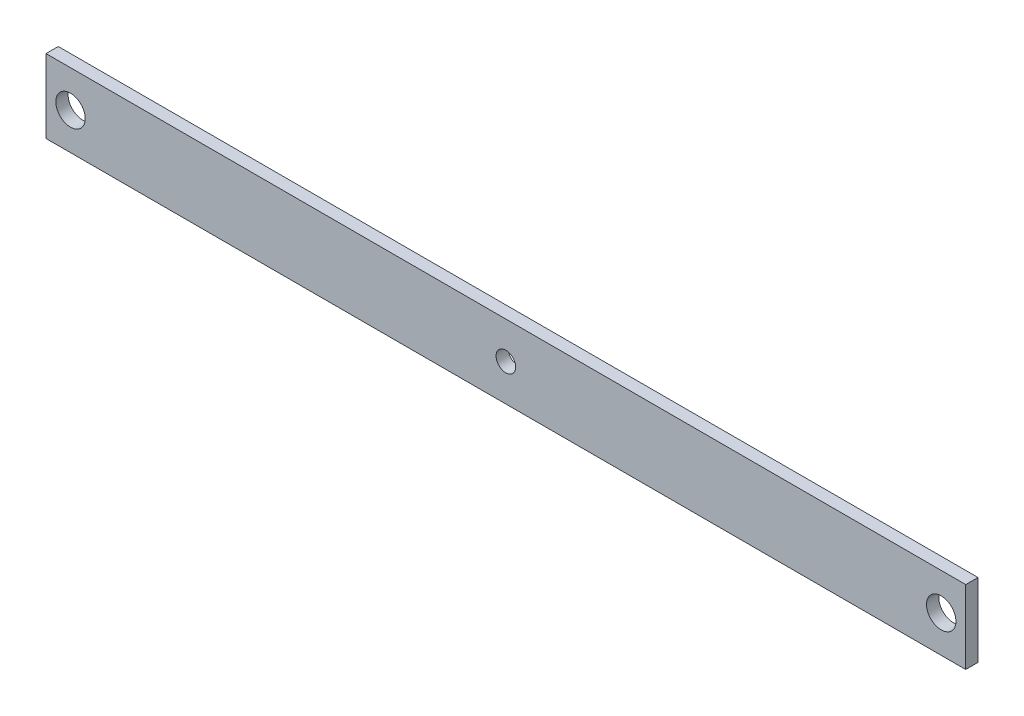
ISO-10303-21;
HEADER;
FILE_DESCRIPTION(('STEP AP214'),'2;1');
FILE_NAME('part.step','',(''),(''),'','','');
FILE_SCHEMA(('AUTOMOTIVE_DESIGN { 1 0 10303 214 1 1 1 1 }'));
ENDSEC;
DATA;
#1=APPLICATION_CONTEXT('core data for automotive mechanical design processes');
#2=APPLICATION_PROTOCOL_DEFINITION('international standard','automotive_design',2000,#1);
#3=PRODUCT_CONTEXT('',#1,'mechanical');
#4=PRODUCT('Part','Part','',(#3));
#5=PRODUCT_RELATED_PRODUCT_CATEGORY('part','',(#4));
#6=PRODUCT_DEFINITION_FORMATION('','',#4);
#7=PRODUCT_DEFINITION_CONTEXT('part definition',#1,'design');
#8=PRODUCT_DEFINITION('design','',#6,#7);
#9=PRODUCT_DEFINITION_SHAPE('','',#8);
#10=(LENGTH_UNIT() NAMED_UNIT(*) SI_UNIT(.MILLI.,.METRE.));
#11=(NAMED_UNIT(*) PLANE_ANGLE_UNIT() SI_UNIT($,.RADIAN.));
#12=(NAMED_UNIT(*) SI_UNIT($,.STERADIAN.) SOLID_ANGLE_UNIT());
#13=UNCERTAINTY_MEASURE_WITH_UNIT(LENGTH_MEASURE(1.E-05),#10,'distance_accuracy_value','');
#14=(GEOMETRIC_REPRESENTATION_CONTEXT(3) GLOBAL_UNCERTAINTY_ASSIGNED_CONTEXT((#13)) GLOBAL_UNIT_ASSIGNED_CONTEXT((#10,
#11,#12)) REPRESENTATION_CONTEXT('',''));
#15=CARTESIAN_POINT('',(0.,0.,0.));
#16=DIRECTION('',(0.,0.,1.));
#17=DIRECTION('',(1.,0.,0.));
#18=AXIS2_PLACEMENT_3D('',#15,#16,#17);
#19=CARTESIAN_POINT('',(0.,0.,5.));
#20=DIRECTION('',(0.,0.,1.));
#21=DIRECTION('',(1.,0.,0.));
#22=AXIS2_PLACEMENT_3D('',#19,#20,#21);
#23=PLANE('',#22);
#24=CARTESIAN_POINT('',(-177.5,0.,5.));
#25=DIRECTION('',(0.,0.,1.));
#26=DIRECTION('',(1.,0.,0.));
#27=AXIS2_PLACEMENT_3D('',#24,#25,#26);
#28=CIRCLE('',#27,6.00000000000002);
#29=CARTESIAN_POINT('',(-171.5,0.,5.));
#30=VERTEX_POINT('',#29);
#31=EDGE_CURVE('E117',#30,#30,#28,.T.);
#32=ORIENTED_EDGE('',*,*,#31,.F.);
#33=EDGE_LOOP('',(#32));
#34=FACE_BOUND('',#33,.T.);
#35=DIRECTION('',(0.,1.,0.));
#36=VECTOR('',#35,1.);
#37=CARTESIAN_POINT('',(187.5,15.,5.));
#38=LINE('',#37,#36);
#39=CARTESIAN_POINT('',(187.5,-15.,5.));
#40=VERTEX_POINT('',#39);
#41=CARTESIAN_POINT('',(187.5,15.,5.));
#42=VERTEX_POINT('',#41);
#43=EDGE_CURVE('E87',#40,#42,#38,.T.);
#44=ORIENTED_EDGE('',*,*,#43,.T.);
#45=DIRECTION('',(-1.,0.,0.));
#46=VECTOR('',#45,1.);
#47=CARTESIAN_POINT('',(-187.5,15.,5.));
#48=LINE('',#47,#46);
#49=CARTESIAN_POINT('',(-187.5,15.,5.));
#50=VERTEX_POINT('',#49);
#51=EDGE_CURVE('E82',#42,#50,#48,.T.);
#52=ORIENTED_EDGE('',*,*,#51,.T.);
#53=DIRECTION('',(0.,-1.,0.));
#54=VECTOR('',#53,1.);
#55=CARTESIAN_POINT('',(-187.5,15.,5.));
#56=LINE('',#55,#54);
#57=CARTESIAN_POINT('',(-187.5,-15.,5.));
#58=VERTEX_POINT('',#57);
#59=EDGE_CURVE('E85',#50,#58,#56,.T.);
#60=ORIENTED_EDGE('',*,*,#59,.T.);
#61=DIRECTION('',(1.,0.,0.));
#62=VECTOR('',#61,1.);
#63=CARTESIAN_POINT('',(-187.5,-15.,5.));
#64=LINE('',#63,#62);
#65=EDGE_CURVE('E52',#58,#40,#64,.T.);
#66=ORIENTED_EDGE('',*,*,#65,.T.);
#67=EDGE_LOOP('',(#44,#52,#60,#66));
#68=FACE_BOUND('',#67,.T.);
#69=CARTESIAN_POINT('',(0.,0.,5.));
#70=DIRECTION('',(0.,0.,1.));
#71=DIRECTION('',(1.,0.,0.));
#72=AXIS2_PLACEMENT_3D('',#69,#70,#71);
#73=CIRCLE('',#72,4.);
#74=CARTESIAN_POINT('',(3.99999999999994,0.,5.));
#75=VERTEX_POINT('',#74);
#76=EDGE_CURVE('E102',#75,#75,#73,.T.);
#77=ORIENTED_EDGE('',*,*,#76,.F.);
#78=EDGE_LOOP('',(#77));
#79=FACE_BOUND('',#78,.T.);
#80=CARTESIAN_POINT('',(177.5,0.,5.));
#81=DIRECTION('',(0.,0.,1.));
#82=DIRECTION('',(1.,0.,0.));
#83=AXIS2_PLACEMENT_3D('',#80,#81,#82);
#84=CIRCLE('',#83,6.00000000000002);
#85=CARTESIAN_POINT('',(183.5,0.,5.));
#86=VERTEX_POINT('',#85);
#87=EDGE_CURVE('E123',#86,#86,#84,.T.);
#88=ORIENTED_EDGE('',*,*,#87,.F.);
#89=EDGE_LOOP('',(#88));
#90=FACE_BOUND('',#89,.T.);
#91=ADVANCED_FACE('F35',(#34,#68,#79,#90),#23,.T.);
#92=CARTESIAN_POINT('',(0.,0.,0.));
#93=DIRECTION('',(0.,0.,1.));
#94=DIRECTION('',(1.,0.,0.));
#95=AXIS2_PLACEMENT_3D('',#92,#93,#94);
#96=PLANE('',#95);
#97=DIRECTION('',(0.,1.,0.));
#98=VECTOR('',#97,1.);
#99=CARTESIAN_POINT('',(187.5,15.,0.));
#100=LINE('',#99,#98);
#101=CARTESIAN_POINT('',(187.5,-15.,0.));
#102=VERTEX_POINT('',#101);
#103=CARTESIAN_POINT('',(187.5,15.,0.));
#104=VERTEX_POINT('',#103);
#105=EDGE_CURVE('E99',#102,#104,#100,.T.);
#106=ORIENTED_EDGE('',*,*,#105,.F.);
#107=DIRECTION('',(1.,0.,0.));
#108=VECTOR('',#107,1.);
#109=CARTESIAN_POINT('',(-187.5,-15.,0.));
#110=LINE('',#109,#108);
#111=CARTESIAN_POINT('',(-187.5,-15.,0.));
#112=VERTEX_POINT('',#111);
#113=EDGE_CURVE('E75',#112,#102,#110,.T.);
#114=ORIENTED_EDGE('',*,*,#113,.F.);
#115=DIRECTION('',(0.,-1.,0.));
#116=VECTOR('',#115,1.);
#117=CARTESIAN_POINT('',(-187.5,15.,0.));
#118=LINE('',#117,#116);
#119=CARTESIAN_POINT('',(-187.5,15.,0.));
#120=VERTEX_POINT('',#119);
#121=EDGE_CURVE('E69',#120,#112,#118,.T.);
#122=ORIENTED_EDGE('',*,*,#121,.F.);
#123=DIRECTION('',(-1.,0.,0.));
#124=VECTOR('',#123,1.);
#125=CARTESIAN_POINT('',(-187.5,15.,0.));
#126=LINE('',#125,#124);
#127=EDGE_CURVE('E91',#104,#120,#126,.T.);
#128=ORIENTED_EDGE('',*,*,#127,.F.);
#129=EDGE_LOOP('',(#106,#114,#122,#128));
#130=FACE_BOUND('',#129,.T.);
#131=CARTESIAN_POINT('',(0.,0.,0.));
#132=DIRECTION('',(0.,0.,1.));
#133=DIRECTION('',(1.,0.,0.));
#134=AXIS2_PLACEMENT_3D('',#131,#132,#133);
#135=CIRCLE('',#134,4.);
#136=CARTESIAN_POINT('',(3.99999999999994,0.,0.));
#137=VERTEX_POINT('',#136);
#138=EDGE_CURVE('E114',#137,#137,#135,.T.);
#139=ORIENTED_EDGE('',*,*,#138,.T.);
#140=EDGE_LOOP('',(#139));
#141=FACE_BOUND('',#140,.T.);
#142=CARTESIAN_POINT('',(-177.5,0.,0.));
#143=DIRECTION('',(0.,0.,1.));
#144=DIRECTION('',(1.,0.,0.));
#145=AXIS2_PLACEMENT_3D('',#142,#143,#144);
#146=CIRCLE('',#145,6.00000000000002);
#147=CARTESIAN_POINT('',(-171.5,0.,0.));
#148=VERTEX_POINT('',#147);
#149=EDGE_CURVE('E120',#148,#148,#146,.T.);
#150=ORIENTED_EDGE('',*,*,#149,.T.);
#151=EDGE_LOOP('',(#150));
#152=FACE_BOUND('',#151,.T.);
#153=CARTESIAN_POINT('',(177.5,0.,0.));
#154=DIRECTION('',(0.,0.,1.));
#155=DIRECTION('',(1.,0.,0.));
#156=AXIS2_PLACEMENT_3D('',#153,#154,#155);
#157=CIRCLE('',#156,6.00000000000002);
#158=CARTESIAN_POINT('',(183.5,0.,0.));
#159=VERTEX_POINT('',#158);
#160=EDGE_CURVE('E126',#159,#159,#157,.T.);
#161=ORIENTED_EDGE('',*,*,#160,.T.);
#162=EDGE_LOOP('',(#161));
#163=FACE_BOUND('',#162,.T.);
#164=ADVANCED_FACE('F110',(#130,#141,#152,#163),#96,.F.);
#165=CARTESIAN_POINT('',(187.5,15.,5.));
#166=DIRECTION('',(-1.,0.,0.));
#167=DIRECTION('',(0.,0.,1.));
#168=AXIS2_PLACEMENT_3D('',#165,#166,#167);
#169=PLANE('',#168);
#170=ORIENTED_EDGE('',*,*,#105,.T.);
#171=DIRECTION('',(0.,0.,-1.));
#172=VECTOR('',#171,1.);
#173=CARTESIAN_POINT('',(187.5,15.,5.));
#174=LINE('',#173,#172);
#175=EDGE_CURVE('E11',#42,#104,#174,.T.);
#176=ORIENTED_EDGE('',*,*,#175,.F.);
#177=ORIENTED_EDGE('',*,*,#43,.F.);
#178=DIRECTION('',(0.,0.,-1.));
#179=VECTOR('',#178,1.);
#180=CARTESIAN_POINT('',(187.5,-15.,5.));
#181=LINE('',#180,#179);
#182=EDGE_CURVE('E95',#40,#102,#181,.T.);
#183=ORIENTED_EDGE('',*,*,#182,.T.);
#184=EDGE_LOOP('',(#170,#176,#177,#183));
#185=FACE_BOUND('',#184,.T.);
#186=ADVANCED_FACE('F37',(#185),#169,.F.);
#187=CARTESIAN_POINT('',(-187.5,15.,5.));
#188=DIRECTION('',(0.,-1.,0.));
#189=DIRECTION('',(0.,0.,-1.));
#190=AXIS2_PLACEMENT_3D('',#187,#188,#189);
#191=PLANE('',#190);
#192=ORIENTED_EDGE('',*,*,#127,.T.);
#193=DIRECTION('',(0.,0.,-1.));
#194=VECTOR('',#193,1.);
#195=CARTESIAN_POINT('',(-187.5,15.,5.));
#196=LINE('',#195,#194);
#197=EDGE_CURVE('E44',#50,#120,#196,.T.);
#198=ORIENTED_EDGE('',*,*,#197,.F.);
#199=ORIENTED_EDGE('',*,*,#51,.F.);
#200=ORIENTED_EDGE('',*,*,#175,.T.);
#201=EDGE_LOOP('',(#192,#198,#199,#200));
#202=FACE_BOUND('',#201,.T.);
#203=ADVANCED_FACE('F90',(#202),#191,.F.);
#204=CARTESIAN_POINT('',(-187.5,15.,5.));
#205=DIRECTION('',(1.,0.,0.));
#206=DIRECTION('',(0.,0.,-1.));
#207=AXIS2_PLACEMENT_3D('',#204,#205,#206);
#208=PLANE('',#207);
#209=ORIENTED_EDGE('',*,*,#121,.T.);
#210=DIRECTION('',(0.,0.,-1.));
#211=VECTOR('',#210,1.);
#212=CARTESIAN_POINT('',(-187.5,-15.,5.));
#213=LINE('',#212,#211);
#214=EDGE_CURVE('E92',#58,#112,#213,.T.);
#215=ORIENTED_EDGE('',*,*,#214,.F.);
#216=ORIENTED_EDGE('',*,*,#59,.F.);
#217=ORIENTED_EDGE('',*,*,#197,.T.);
#218=EDGE_LOOP('',(#209,#215,#216,#217));
#219=FACE_BOUND('',#218,.T.);
#220=ADVANCED_FACE('F93',(#219),#208,.F.);
#221=CARTESIAN_POINT('',(-187.5,-15.,5.));
#222=DIRECTION('',(0.,1.,0.));
#223=DIRECTION('',(0.,0.,1.));
#224=AXIS2_PLACEMENT_3D('',#221,#222,#223);
#225=PLANE('',#224);
#226=ORIENTED_EDGE('',*,*,#113,.T.);
#227=ORIENTED_EDGE('',*,*,#182,.F.);
#228=ORIENTED_EDGE('',*,*,#65,.F.);
#229=ORIENTED_EDGE('',*,*,#214,.T.);
#230=EDGE_LOOP('',(#226,#227,#228,#229));
#231=FACE_BOUND('',#230,.T.);
#232=ADVANCED_FACE('F107',(#231),#225,.F.);
#233=CARTESIAN_POINT('',(0.,0.,5.));
#234=DIRECTION('',(0.,0.,-1.));
#235=DIRECTION('',(-1.,0.,0.));
#236=AXIS2_PLACEMENT_3D('',#233,#234,#235);
#237=CYLINDRICAL_SURFACE('',#236,4.);
#238=ORIENTED_EDGE('',*,*,#76,.T.);
#239=EDGE_LOOP('',(#238));
#240=FACE_BOUND('',#239,.T.);
#241=ORIENTED_EDGE('',*,*,#138,.F.);
#242=EDGE_LOOP('',(#241));
#243=FACE_BOUND('',#242,.T.);
#244=ADVANCED_FACE('F144',(#240,#243),#237,.F.);
#245=CARTESIAN_POINT('',(-177.5,0.,5.));
#246=DIRECTION('',(0.,0.,-1.));
#247=DIRECTION('',(-1.,0.,0.));
#248=AXIS2_PLACEMENT_3D('',#245,#246,#247);
#249=CYLINDRICAL_SURFACE('',#248,6.00000000000002);
#250=ORIENTED_EDGE('',*,*,#31,.T.);
#251=EDGE_LOOP('',(#250));
#252=FACE_BOUND('',#251,.T.);
#253=ORIENTED_EDGE('',*,*,#149,.F.);
#254=EDGE_LOOP('',(#253));
#255=FACE_BOUND('',#254,.T.);
#256=ADVANCED_FACE('F190',(#252,#255),#249,.F.);
#257=CARTESIAN_POINT('',(177.5,0.,5.));
#258=DIRECTION('',(0.,0.,-1.));
#259=DIRECTION('',(-1.,0.,0.));
#260=AXIS2_PLACEMENT_3D('',#257,#258,#259);
#261=CYLINDRICAL_SURFACE('',#260,6.00000000000002);
#262=ORIENTED_EDGE('',*,*,#87,.T.);
#263=EDGE_LOOP('',(#262));
#264=FACE_BOUND('',#263,.T.);
#265=ORIENTED_EDGE('',*,*,#160,.F.);
#266=EDGE_LOOP('',(#265));
#267=FACE_BOUND('',#266,.T.);
#268=ADVANCED_FACE('F132',(#264,#267),#261,.F.);
#269=CLOSED_SHELL('',(#91,#164,#186,#203,#220,#232,#244,#256,#268));
#270=MANIFOLD_SOLID_BREP('B2',#269);
#271=ADVANCED_BREP_SHAPE_REPRESENTATION('',(#18,#270),#14);
#272=SHAPE_DEFINITION_REPRESENTATION(#9,#271);
ENDSEC;
END-ISO-10303-21;
